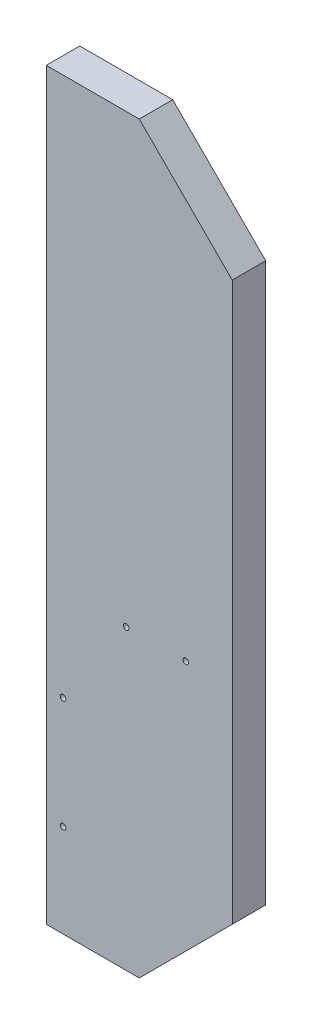
ISO-10303-21;
HEADER;
FILE_DESCRIPTION(('STEP AP214'),'2;1');
FILE_NAME('part.step','',(''),(''),'','','');
FILE_SCHEMA(('AUTOMOTIVE_DESIGN { 1 0 10303 214 1 1 1 1 }'));
ENDSEC;
DATA;
#1=APPLICATION_CONTEXT('core data for automotive mechanical design processes');
#2=APPLICATION_PROTOCOL_DEFINITION('international standard','automotive_design',2000,#1);
#3=PRODUCT_CONTEXT('',#1,'mechanical');
#4=PRODUCT('Part','Part','',(#3));
#5=PRODUCT_RELATED_PRODUCT_CATEGORY('part','',(#4));
#6=PRODUCT_DEFINITION_FORMATION('','',#4);
#7=PRODUCT_DEFINITION_CONTEXT('part definition',#1,'design');
#8=PRODUCT_DEFINITION('design','',#6,#7);
#9=PRODUCT_DEFINITION_SHAPE('','',#8);
#10=(LENGTH_UNIT() NAMED_UNIT(*) SI_UNIT(.MILLI.,.METRE.));
#11=(NAMED_UNIT(*) PLANE_ANGLE_UNIT() SI_UNIT($,.RADIAN.));
#12=(NAMED_UNIT(*) SI_UNIT($,.STERADIAN.) SOLID_ANGLE_UNIT());
#13=UNCERTAINTY_MEASURE_WITH_UNIT(LENGTH_MEASURE(1.E-05),#10,'distance_accuracy_value','');
#14=(GEOMETRIC_REPRESENTATION_CONTEXT(3) GLOBAL_UNCERTAINTY_ASSIGNED_CONTEXT((#13)) GLOBAL_UNIT_ASSIGNED_CONTEXT((#10,
#11,#12)) REPRESENTATION_CONTEXT('',''));
#15=CARTESIAN_POINT('',(0.,0.,0.));
#16=DIRECTION('',(0.,0.,1.));
#17=DIRECTION('',(1.,0.,0.));
#18=AXIS2_PLACEMENT_3D('',#15,#16,#17);
#19=CARTESIAN_POINT('',(0.,0.,18.));
#20=DIRECTION('',(0.,1.,0.));
#21=DIRECTION('',(0.,0.,1.));
#22=AXIS2_PLACEMENT_3D('',#19,#20,#21);
#23=PLANE('',#22);
#24=DIRECTION('',(0.,0.,1.));
#25=VECTOR('',#24,1.);
#26=CARTESIAN_POINT('',(50.,0.,0.));
#27=LINE('',#26,#25);
#28=CARTESIAN_POINT('',(50.,0.,0.));
#29=VERTEX_POINT('',#28);
#30=CARTESIAN_POINT('',(50.,0.,18.));
#31=VERTEX_POINT('',#30);
#32=EDGE_CURVE('E63',#29,#31,#27,.T.);
#33=ORIENTED_EDGE('',*,*,#32,.T.);
#34=DIRECTION('',(1.,0.,0.));
#35=VECTOR('',#34,1.);
#36=CARTESIAN_POINT('',(0.,0.,18.));
#37=LINE('',#36,#35);
#38=CARTESIAN_POINT('',(0.,0.,18.));
#39=VERTEX_POINT('',#38);
#40=EDGE_CURVE('E125',#39,#31,#37,.T.);
#41=ORIENTED_EDGE('',*,*,#40,.F.);
#42=DIRECTION('',(0.,0.,-1.));
#43=VECTOR('',#42,1.);
#44=CARTESIAN_POINT('',(0.,0.,18.));
#45=LINE('',#44,#43);
#46=CARTESIAN_POINT('',(0.,0.,0.));
#47=VERTEX_POINT('',#46);
#48=EDGE_CURVE('E13',#39,#47,#45,.T.);
#49=ORIENTED_EDGE('',*,*,#48,.T.);
#50=DIRECTION('',(1.,0.,0.));
#51=VECTOR('',#50,1.);
#52=CARTESIAN_POINT('',(0.,0.,0.));
#53=LINE('',#52,#51);
#54=EDGE_CURVE('E127',#47,#29,#53,.T.);
#55=ORIENTED_EDGE('',*,*,#54,.T.);
#56=EDGE_LOOP('',(#33,#41,#49,#55));
#57=FACE_BOUND('',#56,.T.);
#58=ADVANCED_FACE('F48',(#57),#23,.F.);
#59=CARTESIAN_POINT('',(100.,0.,18.));
#60=DIRECTION('',(-1.,0.,0.));
#61=DIRECTION('',(0.,0.,1.));
#62=AXIS2_PLACEMENT_3D('',#59,#60,#61);
#63=PLANE('',#62);
#64=DIRECTION('',(0.,1.,0.));
#65=VECTOR('',#64,1.);
#66=CARTESIAN_POINT('',(100.,0.,0.));
#67=LINE('',#66,#65);
#68=CARTESIAN_POINT('',(100.,49.9999999999999,0.));
#69=VERTEX_POINT('',#68);
#70=CARTESIAN_POINT('',(100.,350.,0.));
#71=VERTEX_POINT('',#70);
#72=EDGE_CURVE('E122',#69,#71,#67,.T.);
#73=ORIENTED_EDGE('',*,*,#72,.T.);
#74=DIRECTION('',(0.,0.,1.));
#75=VECTOR('',#74,1.);
#76=CARTESIAN_POINT('',(100.,350.,0.));
#77=LINE('',#76,#75);
#78=CARTESIAN_POINT('',(100.,350.,18.));
#79=VERTEX_POINT('',#78);
#80=EDGE_CURVE('E71',#71,#79,#77,.T.);
#81=ORIENTED_EDGE('',*,*,#80,.T.);
#82=DIRECTION('',(0.,1.,0.));
#83=VECTOR('',#82,1.);
#84=CARTESIAN_POINT('',(100.,0.,18.));
#85=LINE('',#84,#83);
#86=CARTESIAN_POINT('',(100.,49.9999999999999,18.));
#87=VERTEX_POINT('',#86);
#88=EDGE_CURVE('E132',#87,#79,#85,.T.);
#89=ORIENTED_EDGE('',*,*,#88,.F.);
#90=DIRECTION('',(0.,0.,1.));
#91=VECTOR('',#90,1.);
#92=CARTESIAN_POINT('',(100.,49.9999999999999,0.));
#93=LINE('',#92,#91);
#94=EDGE_CURVE('E147',#69,#87,#93,.T.);
#95=ORIENTED_EDGE('',*,*,#94,.F.);
#96=EDGE_LOOP('',(#73,#81,#89,#95));
#97=FACE_BOUND('',#96,.T.);
#98=ADVANCED_FACE('F166',(#97),#63,.F.);
#99=CARTESIAN_POINT('',(0.,0.,18.));
#100=DIRECTION('',(0.,0.,-1.));
#101=DIRECTION('',(-1.,0.,0.));
#102=AXIS2_PLACEMENT_3D('',#99,#100,#101);
#103=PLANE('',#102);
#104=CARTESIAN_POINT('',(75.,160.,18.));
#105=DIRECTION('',(0.,0.,-1.));
#106=DIRECTION('',(-1.,0.,0.));
#107=AXIS2_PLACEMENT_3D('',#104,#105,#106);
#108=CIRCLE('',#107,1.5);
#109=CARTESIAN_POINT('',(73.5,160.,18.));
#110=VERTEX_POINT('',#109);
#111=EDGE_CURVE('E150',#110,#110,#108,.T.);
#112=ORIENTED_EDGE('',*,*,#111,.T.);
#113=EDGE_LOOP('',(#112));
#114=FACE_BOUND('',#113,.T.);
#115=CARTESIAN_POINT('',(9.,110.,18.));
#116=DIRECTION('',(0.,0.,-1.));
#117=DIRECTION('',(-1.,0.,0.));
#118=AXIS2_PLACEMENT_3D('',#115,#116,#117);
#119=CIRCLE('',#118,1.5);
#120=CARTESIAN_POINT('',(7.5,110.,18.));
#121=VERTEX_POINT('',#120);
#122=EDGE_CURVE('E210',#121,#121,#119,.T.);
#123=ORIENTED_EDGE('',*,*,#122,.T.);
#124=EDGE_LOOP('',(#123));
#125=FACE_BOUND('',#124,.T.);
#126=CARTESIAN_POINT('',(9.,50.,18.));
#127=DIRECTION('',(0.,0.,-1.));
#128=DIRECTION('',(-1.,0.,0.));
#129=AXIS2_PLACEMENT_3D('',#126,#127,#128);
#130=CIRCLE('',#129,1.5);
#131=CARTESIAN_POINT('',(7.5,50.,18.));
#132=VERTEX_POINT('',#131);
#133=EDGE_CURVE('E219',#132,#132,#130,.T.);
#134=ORIENTED_EDGE('',*,*,#133,.T.);
#135=EDGE_LOOP('',(#134));
#136=FACE_BOUND('',#135,.T.);
#137=CARTESIAN_POINT('',(43.,160.,18.));
#138=DIRECTION('',(0.,0.,-1.));
#139=DIRECTION('',(-1.,0.,0.));
#140=AXIS2_PLACEMENT_3D('',#137,#138,#139);
#141=CIRCLE('',#140,1.5);
#142=CARTESIAN_POINT('',(41.5,160.,18.));
#143=VERTEX_POINT('',#142);
#144=EDGE_CURVE('E203',#143,#143,#141,.T.);
#145=ORIENTED_EDGE('',*,*,#144,.T.);
#146=EDGE_LOOP('',(#145));
#147=FACE_BOUND('',#146,.T.);
#148=ORIENTED_EDGE('',*,*,#88,.T.);
#149=DIRECTION('',(0.707106781186544,-0.707106781186551,0.));
#150=VECTOR('',#149,1.);
#151=CARTESIAN_POINT('',(225.,224.999999999998,18.));
#152=LINE('',#151,#150);
#153=CARTESIAN_POINT('',(50.,400.,18.));
#154=VERTEX_POINT('',#153);
#155=EDGE_CURVE('E107',#154,#79,#152,.T.);
#156=ORIENTED_EDGE('',*,*,#155,.F.);
#157=DIRECTION('',(-1.,0.,0.));
#158=VECTOR('',#157,1.);
#159=CARTESIAN_POINT('',(0.,400.,18.));
#160=LINE('',#159,#158);
#161=CARTESIAN_POINT('',(0.,400.,18.));
#162=VERTEX_POINT('',#161);
#163=EDGE_CURVE('E115',#154,#162,#160,.T.);
#164=ORIENTED_EDGE('',*,*,#163,.T.);
#165=DIRECTION('',(0.,-1.,0.));
#166=VECTOR('',#165,1.);
#167=CARTESIAN_POINT('',(0.,0.,18.));
#168=LINE('',#167,#166);
#169=EDGE_CURVE('E121',#162,#39,#168,.T.);
#170=ORIENTED_EDGE('',*,*,#169,.T.);
#171=ORIENTED_EDGE('',*,*,#40,.T.);
#172=DIRECTION('',(0.707106781186549,0.707106781186546,0.));
#173=VECTOR('',#172,1.);
#174=CARTESIAN_POINT('',(24.9999999999999,-25.,18.));
#175=LINE('',#174,#173);
#176=EDGE_CURVE('E145',#31,#87,#175,.T.);
#177=ORIENTED_EDGE('',*,*,#176,.T.);
#178=EDGE_LOOP('',(#148,#156,#164,#170,#171,#177));
#179=FACE_BOUND('',#178,.T.);
#180=ADVANCED_FACE('F154',(#114,#125,#136,#147,#179),#103,.F.);
#181=CARTESIAN_POINT('',(0.,0.,0.));
#182=DIRECTION('',(0.,0.,-1.));
#183=DIRECTION('',(-1.,0.,0.));
#184=AXIS2_PLACEMENT_3D('',#181,#182,#183);
#185=PLANE('',#184);
#186=CARTESIAN_POINT('',(75.,160.,0.));
#187=DIRECTION('',(0.,0.,-1.));
#188=DIRECTION('',(-1.,0.,0.));
#189=AXIS2_PLACEMENT_3D('',#186,#187,#188);
#190=CIRCLE('',#189,1.5);
#191=CARTESIAN_POINT('',(73.5,160.,0.));
#192=VERTEX_POINT('',#191);
#193=EDGE_CURVE('E202',#192,#192,#190,.T.);
#194=ORIENTED_EDGE('',*,*,#193,.F.);
#195=EDGE_LOOP('',(#194));
#196=FACE_BOUND('',#195,.T.);
#197=CARTESIAN_POINT('',(9.,110.,0.));
#198=DIRECTION('',(0.,0.,-1.));
#199=DIRECTION('',(-1.,0.,0.));
#200=AXIS2_PLACEMENT_3D('',#197,#198,#199);
#201=CIRCLE('',#200,1.5);
#202=CARTESIAN_POINT('',(7.5,110.,0.));
#203=VERTEX_POINT('',#202);
#204=EDGE_CURVE('E214',#203,#203,#201,.T.);
#205=ORIENTED_EDGE('',*,*,#204,.F.);
#206=EDGE_LOOP('',(#205));
#207=FACE_BOUND('',#206,.T.);
#208=CARTESIAN_POINT('',(9.,50.,0.));
#209=DIRECTION('',(0.,0.,-1.));
#210=DIRECTION('',(-1.,0.,0.));
#211=AXIS2_PLACEMENT_3D('',#208,#209,#210);
#212=CIRCLE('',#211,1.5);
#213=CARTESIAN_POINT('',(7.5,50.,0.));
#214=VERTEX_POINT('',#213);
#215=EDGE_CURVE('E213',#214,#214,#212,.T.);
#216=ORIENTED_EDGE('',*,*,#215,.F.);
#217=EDGE_LOOP('',(#216));
#218=FACE_BOUND('',#217,.T.);
#219=CARTESIAN_POINT('',(43.,160.,0.));
#220=DIRECTION('',(0.,0.,-1.));
#221=DIRECTION('',(-1.,0.,0.));
#222=AXIS2_PLACEMENT_3D('',#219,#220,#221);
#223=CIRCLE('',#222,1.5);
#224=CARTESIAN_POINT('',(41.5,160.,0.));
#225=VERTEX_POINT('',#224);
#226=EDGE_CURVE('E207',#225,#225,#223,.T.);
#227=ORIENTED_EDGE('',*,*,#226,.F.);
#228=EDGE_LOOP('',(#227));
#229=FACE_BOUND('',#228,.T.);
#230=DIRECTION('',(0.707106781186544,-0.707106781186551,0.));
#231=VECTOR('',#230,1.);
#232=CARTESIAN_POINT('',(225.,224.999999999998,0.));
#233=LINE('',#232,#231);
#234=CARTESIAN_POINT('',(50.,400.,0.));
#235=VERTEX_POINT('',#234);
#236=EDGE_CURVE('E98',#235,#71,#233,.T.);
#237=ORIENTED_EDGE('',*,*,#236,.T.);
#238=ORIENTED_EDGE('',*,*,#72,.F.);
#239=DIRECTION('',(0.707106781186549,0.707106781186546,0.));
#240=VECTOR('',#239,1.);
#241=CARTESIAN_POINT('',(24.9999999999999,-25.,0.));
#242=LINE('',#241,#240);
#243=EDGE_CURVE('E143',#29,#69,#242,.T.);
#244=ORIENTED_EDGE('',*,*,#243,.F.);
#245=ORIENTED_EDGE('',*,*,#54,.F.);
#246=DIRECTION('',(0.,-1.,0.));
#247=VECTOR('',#246,1.);
#248=CARTESIAN_POINT('',(0.,0.,0.));
#249=LINE('',#248,#247);
#250=CARTESIAN_POINT('',(0.,400.,0.));
#251=VERTEX_POINT('',#250);
#252=EDGE_CURVE('E120',#251,#47,#249,.T.);
#253=ORIENTED_EDGE('',*,*,#252,.F.);
#254=DIRECTION('',(-1.,0.,0.));
#255=VECTOR('',#254,1.);
#256=CARTESIAN_POINT('',(0.,400.,0.));
#257=LINE('',#256,#255);
#258=EDGE_CURVE('E113',#235,#251,#257,.T.);
#259=ORIENTED_EDGE('',*,*,#258,.F.);
#260=EDGE_LOOP('',(#237,#238,#244,#245,#253,#259));
#261=FACE_BOUND('',#260,.T.);
#262=ADVANCED_FACE('F118',(#196,#207,#218,#229,#261),#185,.T.);
#263=CARTESIAN_POINT('',(0.,0.,18.));
#264=DIRECTION('',(1.,0.,0.));
#265=DIRECTION('',(0.,0.,-1.));
#266=AXIS2_PLACEMENT_3D('',#263,#264,#265);
#267=PLANE('',#266);
#268=ORIENTED_EDGE('',*,*,#252,.T.);
#269=ORIENTED_EDGE('',*,*,#48,.F.);
#270=ORIENTED_EDGE('',*,*,#169,.F.);
#271=DIRECTION('',(0.,0.,-1.));
#272=VECTOR('',#271,1.);
#273=CARTESIAN_POINT('',(0.,400.,18.));
#274=LINE('',#273,#272);
#275=EDGE_CURVE('E56',#162,#251,#274,.T.);
#276=ORIENTED_EDGE('',*,*,#275,.T.);
#277=EDGE_LOOP('',(#268,#269,#270,#276));
#278=FACE_BOUND('',#277,.T.);
#279=ADVANCED_FACE('F50',(#278),#267,.F.);
#280=CARTESIAN_POINT('',(0.,400.,18.));
#281=DIRECTION('',(0.,-1.,0.));
#282=DIRECTION('',(0.,0.,-1.));
#283=AXIS2_PLACEMENT_3D('',#280,#281,#282);
#284=PLANE('',#283);
#285=ORIENTED_EDGE('',*,*,#163,.F.);
#286=DIRECTION('',(0.,0.,1.));
#287=VECTOR('',#286,1.);
#288=CARTESIAN_POINT('',(50.,400.,0.));
#289=LINE('',#288,#287);
#290=EDGE_CURVE('E101',#235,#154,#289,.T.);
#291=ORIENTED_EDGE('',*,*,#290,.F.);
#292=ORIENTED_EDGE('',*,*,#258,.T.);
#293=ORIENTED_EDGE('',*,*,#275,.F.);
#294=EDGE_LOOP('',(#285,#291,#292,#293));
#295=FACE_BOUND('',#294,.T.);
#296=ADVANCED_FACE('F111',(#295),#284,.F.);
#297=CARTESIAN_POINT('',(24.9999999999999,-25.,0.));
#298=DIRECTION('',(0.707106781186546,-0.707106781186549,0.));
#299=DIRECTION('',(0.707106781186549,0.707106781186546,0.));
#300=AXIS2_PLACEMENT_3D('',#297,#298,#299);
#301=PLANE('',#300);
#302=ORIENTED_EDGE('',*,*,#176,.F.);
#303=ORIENTED_EDGE('',*,*,#32,.F.);
#304=ORIENTED_EDGE('',*,*,#243,.T.);
#305=ORIENTED_EDGE('',*,*,#94,.T.);
#306=EDGE_LOOP('',(#302,#303,#304,#305));
#307=FACE_BOUND('',#306,.T.);
#308=ADVANCED_FACE('F161',(#307),#301,.T.);
#309=CARTESIAN_POINT('',(225.,224.999999999998,0.));
#310=DIRECTION('',(-0.707106781186551,-0.707106781186544,0.));
#311=DIRECTION('',(0.707106781186544,-0.707106781186551,0.));
#312=AXIS2_PLACEMENT_3D('',#309,#310,#311);
#313=PLANE('',#312);
#314=ORIENTED_EDGE('',*,*,#155,.T.);
#315=ORIENTED_EDGE('',*,*,#80,.F.);
#316=ORIENTED_EDGE('',*,*,#236,.F.);
#317=ORIENTED_EDGE('',*,*,#290,.T.);
#318=EDGE_LOOP('',(#314,#315,#316,#317));
#319=FACE_BOUND('',#318,.T.);
#320=ADVANCED_FACE('F100',(#319),#313,.F.);
#321=CARTESIAN_POINT('',(43.,160.,18.));
#322=DIRECTION('',(0.,0.,-1.));
#323=DIRECTION('',(-1.,0.,0.));
#324=AXIS2_PLACEMENT_3D('',#321,#322,#323);
#325=CYLINDRICAL_SURFACE('',#324,1.5);
#326=ORIENTED_EDGE('',*,*,#144,.F.);
#327=EDGE_LOOP('',(#326));
#328=FACE_BOUND('',#327,.T.);
#329=ORIENTED_EDGE('',*,*,#226,.T.);
#330=EDGE_LOOP('',(#329));
#331=FACE_BOUND('',#330,.T.);
#332=ADVANCED_FACE('F180',(#328,#331),#325,.F.);
#333=CARTESIAN_POINT('',(9.,50.,18.));
#334=DIRECTION('',(0.,0.,-1.));
#335=DIRECTION('',(-1.,0.,0.));
#336=AXIS2_PLACEMENT_3D('',#333,#334,#335);
#337=CYLINDRICAL_SURFACE('',#336,1.5);
#338=ORIENTED_EDGE('',*,*,#133,.F.);
#339=EDGE_LOOP('',(#338));
#340=FACE_BOUND('',#339,.T.);
#341=ORIENTED_EDGE('',*,*,#215,.T.);
#342=EDGE_LOOP('',(#341));
#343=FACE_BOUND('',#342,.T.);
#344=ADVANCED_FACE('F181',(#340,#343),#337,.F.);
#345=CARTESIAN_POINT('',(9.,110.,18.));
#346=DIRECTION('',(0.,0.,-1.));
#347=DIRECTION('',(-1.,0.,0.));
#348=AXIS2_PLACEMENT_3D('',#345,#346,#347);
#349=CYLINDRICAL_SURFACE('',#348,1.5);
#350=ORIENTED_EDGE('',*,*,#122,.F.);
#351=EDGE_LOOP('',(#350));
#352=FACE_BOUND('',#351,.T.);
#353=ORIENTED_EDGE('',*,*,#204,.T.);
#354=EDGE_LOOP('',(#353));
#355=FACE_BOUND('',#354,.T.);
#356=ADVANCED_FACE('F184',(#352,#355),#349,.F.);
#357=CARTESIAN_POINT('',(75.,160.,18.));
#358=DIRECTION('',(0.,0.,-1.));
#359=DIRECTION('',(-1.,0.,0.));
#360=AXIS2_PLACEMENT_3D('',#357,#358,#359);
#361=CYLINDRICAL_SURFACE('',#360,1.5);
#362=ORIENTED_EDGE('',*,*,#111,.F.);
#363=EDGE_LOOP('',(#362));
#364=FACE_BOUND('',#363,.T.);
#365=ORIENTED_EDGE('',*,*,#193,.T.);
#366=EDGE_LOOP('',(#365));
#367=FACE_BOUND('',#366,.T.);
#368=ADVANCED_FACE('F191',(#364,#367),#361,.F.);
#369=CLOSED_SHELL('',(#58,#98,#180,#262,#279,#296,#308,#320,#332,#344,#356,#368));
#370=MANIFOLD_SOLID_BREP('B2',#369);
#371=ADVANCED_BREP_SHAPE_REPRESENTATION('',(#18,#370),#14);
#372=SHAPE_DEFINITION_REPRESENTATION(#9,#371);
ENDSEC;
END-ISO-10303-21;
